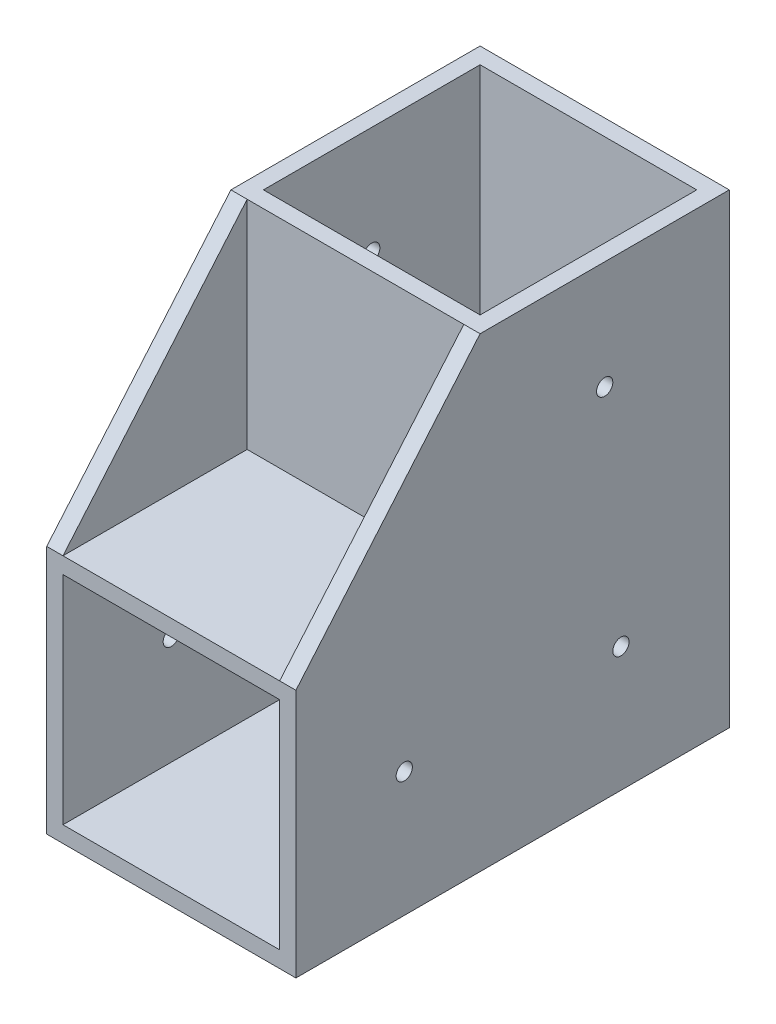
ISO-10303-21;
HEADER;
FILE_DESCRIPTION(('STEP AP214'),'2;1');
FILE_NAME('part.step','',(''),(''),'','','');
FILE_SCHEMA(('AUTOMOTIVE_DESIGN { 1 0 10303 214 1 1 1 1 }'));
ENDSEC;
DATA;
#1=APPLICATION_CONTEXT('core data for automotive mechanical design processes');
#2=APPLICATION_PROTOCOL_DEFINITION('international standard','automotive_design',2000,#1);
#3=PRODUCT_CONTEXT('',#1,'mechanical');
#4=PRODUCT('Part','Part','',(#3));
#5=PRODUCT_RELATED_PRODUCT_CATEGORY('part','',(#4));
#6=PRODUCT_DEFINITION_FORMATION('','',#4);
#7=PRODUCT_DEFINITION_CONTEXT('part definition',#1,'design');
#8=PRODUCT_DEFINITION('design','',#6,#7);
#9=PRODUCT_DEFINITION_SHAPE('','',#8);
#10=(LENGTH_UNIT() NAMED_UNIT(*) SI_UNIT(.MILLI.,.METRE.));
#11=(NAMED_UNIT(*) PLANE_ANGLE_UNIT() SI_UNIT($,.RADIAN.));
#12=(NAMED_UNIT(*) SI_UNIT($,.STERADIAN.) SOLID_ANGLE_UNIT());
#13=UNCERTAINTY_MEASURE_WITH_UNIT(LENGTH_MEASURE(1.E-05),#10,'distance_accuracy_value','');
#14=(GEOMETRIC_REPRESENTATION_CONTEXT(3) GLOBAL_UNCERTAINTY_ASSIGNED_CONTEXT((#13)) GLOBAL_UNIT_ASSIGNED_CONTEXT((#10,
#11,#12)) REPRESENTATION_CONTEXT('',''));
#15=CARTESIAN_POINT('',(0.,0.,0.));
#16=DIRECTION('',(0.,0.,1.));
#17=DIRECTION('',(1.,0.,0.));
#18=AXIS2_PLACEMENT_3D('',#15,#16,#17);
#19=CARTESIAN_POINT('',(0.,0.,80.));
#20=DIRECTION('',(0.,-1.,0.));
#21=DIRECTION('',(0.,0.,-1.));
#22=AXIS2_PLACEMENT_3D('',#19,#20,#21);
#23=PLANE('',#22);
#24=DIRECTION('',(0.,0.,1.));
#25=VECTOR('',#24,1.);
#26=CARTESIAN_POINT('',(3.,0.,80.));
#27=LINE('',#26,#25);
#28=CARTESIAN_POINT('',(3.,0.,46.));
#29=VERTEX_POINT('',#28);
#30=CARTESIAN_POINT('',(3.,0.,80.));
#31=VERTEX_POINT('',#30);
#32=EDGE_CURVE('E157',#29,#31,#27,.T.);
#33=ORIENTED_EDGE('',*,*,#32,.T.);
#34=DIRECTION('',(-1.,0.,0.));
#35=VECTOR('',#34,1.);
#36=CARTESIAN_POINT('',(0.,0.,80.));
#37=LINE('',#36,#35);
#38=CARTESIAN_POINT('',(43.,0.,80.));
#39=VERTEX_POINT('',#38);
#40=EDGE_CURVE('E231',#39,#31,#37,.T.);
#41=ORIENTED_EDGE('',*,*,#40,.F.);
#42=DIRECTION('',(0.,0.,-1.));
#43=VECTOR('',#42,1.);
#44=CARTESIAN_POINT('',(43.,0.,46.));
#45=LINE('',#44,#43);
#46=CARTESIAN_POINT('',(43.,0.,46.));
#47=VERTEX_POINT('',#46);
#48=EDGE_CURVE('E177',#39,#47,#45,.T.);
#49=ORIENTED_EDGE('',*,*,#48,.T.);
#50=DIRECTION('',(1.,0.,0.));
#51=VECTOR('',#50,1.);
#52=CARTESIAN_POINT('',(0.,0.,46.));
#53=LINE('',#52,#51);
#54=EDGE_CURVE('E170',#29,#47,#53,.T.);
#55=ORIENTED_EDGE('',*,*,#54,.F.);
#56=EDGE_LOOP('',(#33,#41,#49,#55));
#57=FACE_BOUND('',#56,.T.);
#58=ADVANCED_FACE('F42',(#57),#23,.F.);
#59=CARTESIAN_POINT('',(0.,40.,46.));
#60=DIRECTION('',(0.,0.,-1.));
#61=DIRECTION('',(-1.,0.,0.));
#62=AXIS2_PLACEMENT_3D('',#59,#60,#61);
#63=PLANE('',#62);
#64=DIRECTION('',(0.,-1.,0.));
#65=VECTOR('',#64,1.);
#66=CARTESIAN_POINT('',(3.,0.,46.));
#67=LINE('',#66,#65);
#68=CARTESIAN_POINT('',(3.,40.,46.));
#69=VERTEX_POINT('',#68);
#70=EDGE_CURVE('E160',#69,#29,#67,.T.);
#71=ORIENTED_EDGE('',*,*,#70,.T.);
#72=ORIENTED_EDGE('',*,*,#54,.T.);
#73=DIRECTION('',(0.,1.,0.));
#74=VECTOR('',#73,1.);
#75=CARTESIAN_POINT('',(43.,40.,46.));
#76=LINE('',#75,#74);
#77=CARTESIAN_POINT('',(43.,40.,46.));
#78=VERTEX_POINT('',#77);
#79=EDGE_CURVE('E272',#47,#78,#76,.T.);
#80=ORIENTED_EDGE('',*,*,#79,.T.);
#81=DIRECTION('',(1.,0.,0.));
#82=VECTOR('',#81,1.);
#83=CARTESIAN_POINT('',(0.,40.,46.));
#84=LINE('',#83,#82);
#85=EDGE_CURVE('E172',#69,#78,#84,.T.);
#86=ORIENTED_EDGE('',*,*,#85,.F.);
#87=EDGE_LOOP('',(#71,#72,#80,#86));
#88=FACE_BOUND('',#87,.T.);
#89=ADVANCED_FACE('F168',(#88),#63,.F.);
#90=CARTESIAN_POINT('',(0.,0.,80.));
#91=DIRECTION('',(0.,0.,1.));
#92=DIRECTION('',(1.,0.,0.));
#93=AXIS2_PLACEMENT_3D('',#90,#91,#92);
#94=PLANE('',#93);
#95=DIRECTION('',(0.,-1.,0.));
#96=VECTOR('',#95,1.);
#97=CARTESIAN_POINT('',(0.,0.,80.));
#98=LINE('',#97,#96);
#99=CARTESIAN_POINT('',(0.,0.,80.));
#100=VERTEX_POINT('',#99);
#101=CARTESIAN_POINT('',(0.,-46.,80.));
#102=VERTEX_POINT('',#101);
#103=EDGE_CURVE('E222',#100,#102,#98,.T.);
#104=ORIENTED_EDGE('',*,*,#103,.T.);
#105=DIRECTION('',(1.,0.,0.));
#106=VECTOR('',#105,1.);
#107=CARTESIAN_POINT('',(0.,-46.,80.));
#108=LINE('',#107,#106);
#109=CARTESIAN_POINT('',(46.,-46.,80.));
#110=VERTEX_POINT('',#109);
#111=EDGE_CURVE('E225',#102,#110,#108,.T.);
#112=ORIENTED_EDGE('',*,*,#111,.T.);
#113=DIRECTION('',(0.,1.,0.));
#114=VECTOR('',#113,1.);
#115=CARTESIAN_POINT('',(46.,0.,80.));
#116=LINE('',#115,#114);
#117=CARTESIAN_POINT('',(46.,0.,80.));
#118=VERTEX_POINT('',#117);
#119=EDGE_CURVE('E228',#110,#118,#116,.T.);
#120=ORIENTED_EDGE('',*,*,#119,.T.);
#121=EDGE_CURVE('E232',#118,#39,#37,.T.);
#122=ORIENTED_EDGE('',*,*,#121,.T.);
#123=ORIENTED_EDGE('',*,*,#40,.T.);
#124=DIRECTION('',(-1.,0.,0.));
#125=VECTOR('',#124,1.);
#126=CARTESIAN_POINT('',(3.,0.,80.));
#127=LINE('',#126,#125);
#128=EDGE_CURVE('E265',#31,#100,#127,.T.);
#129=ORIENTED_EDGE('',*,*,#128,.T.);
#130=EDGE_LOOP('',(#104,#112,#120,#122,#123,#129));
#131=FACE_BOUND('',#130,.T.);
#132=DIRECTION('',(1.,0.,0.));
#133=VECTOR('',#132,1.);
#134=CARTESIAN_POINT('',(3.00000000000001,-43.,80.));
#135=LINE('',#134,#133);
#136=CARTESIAN_POINT('',(3.00000000000001,-43.,80.));
#137=VERTEX_POINT('',#136);
#138=CARTESIAN_POINT('',(43.,-43.,80.));
#139=VERTEX_POINT('',#138);
#140=EDGE_CURVE('E192',#137,#139,#135,.T.);
#141=ORIENTED_EDGE('',*,*,#140,.F.);
#142=DIRECTION('',(0.,-1.,0.));
#143=VECTOR('',#142,1.);
#144=CARTESIAN_POINT('',(3.,-3.,80.));
#145=LINE('',#144,#143);
#146=CARTESIAN_POINT('',(3.,-3.,80.));
#147=VERTEX_POINT('',#146);
#148=EDGE_CURVE('E190',#147,#137,#145,.T.);
#149=ORIENTED_EDGE('',*,*,#148,.F.);
#150=DIRECTION('',(-1.,0.,0.));
#151=VECTOR('',#150,1.);
#152=CARTESIAN_POINT('',(3.,-3.,80.));
#153=LINE('',#152,#151);
#154=CARTESIAN_POINT('',(43.,-3.,80.));
#155=VERTEX_POINT('',#154);
#156=EDGE_CURVE('E198',#155,#147,#153,.T.);
#157=ORIENTED_EDGE('',*,*,#156,.F.);
#158=DIRECTION('',(0.,1.,0.));
#159=VECTOR('',#158,1.);
#160=CARTESIAN_POINT('',(43.,-3.,80.));
#161=LINE('',#160,#159);
#162=EDGE_CURVE('E195',#139,#155,#161,.T.);
#163=ORIENTED_EDGE('',*,*,#162,.F.);
#164=EDGE_LOOP('',(#141,#149,#157,#163));
#165=FACE_BOUND('',#164,.T.);
#166=ADVANCED_FACE('F324',(#131,#165),#94,.T.);
#167=CARTESIAN_POINT('',(0.,0.,0.));
#168=DIRECTION('',(0.,0.,1.));
#169=DIRECTION('',(1.,0.,0.));
#170=AXIS2_PLACEMENT_3D('',#167,#168,#169);
#171=PLANE('',#170);
#172=DIRECTION('',(0.,-1.,0.));
#173=VECTOR('',#172,1.);
#174=CARTESIAN_POINT('',(0.,0.,0.));
#175=LINE('',#174,#173);
#176=CARTESIAN_POINT('',(0.,40.,0.));
#177=VERTEX_POINT('',#176);
#178=CARTESIAN_POINT('',(0.,-46.,0.));
#179=VERTEX_POINT('',#178);
#180=EDGE_CURVE('E221',#177,#179,#175,.T.);
#181=ORIENTED_EDGE('',*,*,#180,.F.);
#182=DIRECTION('',(-1.,0.,0.));
#183=VECTOR('',#182,1.);
#184=CARTESIAN_POINT('',(0.,40.,0.));
#185=LINE('',#184,#183);
#186=CARTESIAN_POINT('',(46.,40.,0.));
#187=VERTEX_POINT('',#186);
#188=EDGE_CURVE('E188',#187,#177,#185,.T.);
#189=ORIENTED_EDGE('',*,*,#188,.F.);
#190=DIRECTION('',(0.,1.,0.));
#191=VECTOR('',#190,1.);
#192=CARTESIAN_POINT('',(46.,0.,0.));
#193=LINE('',#192,#191);
#194=CARTESIAN_POINT('',(46.,-46.,0.));
#195=VERTEX_POINT('',#194);
#196=EDGE_CURVE('E226',#195,#187,#193,.T.);
#197=ORIENTED_EDGE('',*,*,#196,.F.);
#198=DIRECTION('',(1.,0.,0.));
#199=VECTOR('',#198,1.);
#200=CARTESIAN_POINT('',(0.,-46.,0.));
#201=LINE('',#200,#199);
#202=EDGE_CURVE('E237',#179,#195,#201,.T.);
#203=ORIENTED_EDGE('',*,*,#202,.F.);
#204=EDGE_LOOP('',(#181,#189,#197,#203));
#205=FACE_BOUND('',#204,.T.);
#206=DIRECTION('',(0.,-1.,0.));
#207=VECTOR('',#206,1.);
#208=CARTESIAN_POINT('',(3.,-3.,0.));
#209=LINE('',#208,#207);
#210=CARTESIAN_POINT('',(3.,-3.,0.));
#211=VERTEX_POINT('',#210);
#212=CARTESIAN_POINT('',(3.00000000000001,-43.,0.));
#213=VERTEX_POINT('',#212);
#214=EDGE_CURVE('E201',#211,#213,#209,.T.);
#215=ORIENTED_EDGE('',*,*,#214,.T.);
#216=DIRECTION('',(1.,0.,0.));
#217=VECTOR('',#216,1.);
#218=CARTESIAN_POINT('',(3.00000000000001,-43.,0.));
#219=LINE('',#218,#217);
#220=CARTESIAN_POINT('',(43.,-43.,0.));
#221=VERTEX_POINT('',#220);
#222=EDGE_CURVE('E204',#213,#221,#219,.T.);
#223=ORIENTED_EDGE('',*,*,#222,.T.);
#224=DIRECTION('',(0.,1.,0.));
#225=VECTOR('',#224,1.);
#226=CARTESIAN_POINT('',(43.,-3.,0.));
#227=LINE('',#226,#225);
#228=CARTESIAN_POINT('',(43.,-3.,0.));
#229=VERTEX_POINT('',#228);
#230=EDGE_CURVE('E207',#221,#229,#227,.T.);
#231=ORIENTED_EDGE('',*,*,#230,.T.);
#232=DIRECTION('',(-1.,0.,0.));
#233=VECTOR('',#232,1.);
#234=CARTESIAN_POINT('',(3.,-3.,0.));
#235=LINE('',#234,#233);
#236=EDGE_CURVE('E193',#229,#211,#235,.T.);
#237=ORIENTED_EDGE('',*,*,#236,.T.);
#238=EDGE_LOOP('',(#215,#223,#231,#237));
#239=FACE_BOUND('',#238,.T.);
#240=ADVANCED_FACE('F334',(#205,#239),#171,.F.);
#241=CARTESIAN_POINT('',(0.,0.,80.));
#242=DIRECTION('',(1.,0.,0.));
#243=DIRECTION('',(0.,1.,0.));
#244=AXIS2_PLACEMENT_3D('',#241,#242,#243);
#245=PLANE('',#244);
#246=CARTESIAN_POINT('',(0.,20.,23.));
#247=DIRECTION('',(-1.,0.,0.));
#248=DIRECTION('',(0.,-1.,0.));
#249=AXIS2_PLACEMENT_3D('',#246,#247,#248);
#250=CIRCLE('',#249,1.5);
#251=CARTESIAN_POINT('',(0.,18.5,23.));
#252=VERTEX_POINT('',#251);
#253=EDGE_CURVE('E663',#252,#252,#250,.T.);
#254=ORIENTED_EDGE('',*,*,#253,.F.);
#255=EDGE_LOOP('',(#254));
#256=FACE_BOUND('',#255,.T.);
#257=CARTESIAN_POINT('',(0.,-23.,20.));
#258=DIRECTION('',(-1.,0.,0.));
#259=DIRECTION('',(0.,-1.,0.));
#260=AXIS2_PLACEMENT_3D('',#257,#258,#259);
#261=CIRCLE('',#260,1.5);
#262=CARTESIAN_POINT('',(0.,-24.5,20.));
#263=VERTEX_POINT('',#262);
#264=EDGE_CURVE('E661',#263,#263,#261,.T.);
#265=ORIENTED_EDGE('',*,*,#264,.F.);
#266=EDGE_LOOP('',(#265));
#267=FACE_BOUND('',#266,.T.);
#268=CARTESIAN_POINT('',(0.,-23.,60.));
#269=DIRECTION('',(-1.,0.,0.));
#270=DIRECTION('',(0.,-1.,0.));
#271=AXIS2_PLACEMENT_3D('',#268,#269,#270);
#272=CIRCLE('',#271,1.5);
#273=CARTESIAN_POINT('',(0.,-24.5,60.));
#274=VERTEX_POINT('',#273);
#275=EDGE_CURVE('E669',#274,#274,#272,.T.);
#276=ORIENTED_EDGE('',*,*,#275,.F.);
#277=EDGE_LOOP('',(#276));
#278=FACE_BOUND('',#277,.T.);
#279=ORIENTED_EDGE('',*,*,#180,.T.);
#280=DIRECTION('',(0.,0.,-1.));
#281=VECTOR('',#280,1.);
#282=CARTESIAN_POINT('',(0.,-46.,80.));
#283=LINE('',#282,#281);
#284=EDGE_CURVE('E11',#102,#179,#283,.T.);
#285=ORIENTED_EDGE('',*,*,#284,.F.);
#286=ORIENTED_EDGE('',*,*,#103,.F.);
#287=DIRECTION('',(0.,0.761939317759459,-0.64764842009554));
#288=VECTOR('',#287,1.);
#289=CARTESIAN_POINT('',(0.,40.,46.));
#290=LINE('',#289,#288);
#291=CARTESIAN_POINT('',(0.,40.,46.));
#292=VERTEX_POINT('',#291);
#293=EDGE_CURVE('E174',#100,#292,#290,.T.);
#294=ORIENTED_EDGE('',*,*,#293,.T.);
#295=DIRECTION('',(0.,0.,1.));
#296=VECTOR('',#295,1.);
#297=CARTESIAN_POINT('',(0.,40.,0.));
#298=LINE('',#297,#296);
#299=EDGE_CURVE('E178',#177,#292,#298,.T.);
#300=ORIENTED_EDGE('',*,*,#299,.F.);
#301=EDGE_LOOP('',(#279,#285,#286,#294,#300));
#302=FACE_BOUND('',#301,.T.);
#303=ADVANCED_FACE('F44',(#256,#267,#278,#302),#245,.F.);
#304=CARTESIAN_POINT('',(0.,-46.,80.));
#305=DIRECTION('',(0.,1.,0.));
#306=DIRECTION('',(0.,0.,1.));
#307=AXIS2_PLACEMENT_3D('',#304,#305,#306);
#308=PLANE('',#307);
#309=ORIENTED_EDGE('',*,*,#202,.T.);
#310=DIRECTION('',(0.,0.,-1.));
#311=VECTOR('',#310,1.);
#312=CARTESIAN_POINT('',(46.,-46.,80.));
#313=LINE('',#312,#311);
#314=EDGE_CURVE('E51',#110,#195,#313,.T.);
#315=ORIENTED_EDGE('',*,*,#314,.F.);
#316=ORIENTED_EDGE('',*,*,#111,.F.);
#317=ORIENTED_EDGE('',*,*,#284,.T.);
#318=EDGE_LOOP('',(#309,#315,#316,#317));
#319=FACE_BOUND('',#318,.T.);
#320=ADVANCED_FACE('F337',(#319),#308,.F.);
#321=CARTESIAN_POINT('',(46.,0.,80.));
#322=DIRECTION('',(-1.,0.,0.));
#323=DIRECTION('',(0.,-1.,0.));
#324=AXIS2_PLACEMENT_3D('',#321,#322,#323);
#325=PLANE('',#324);
#326=CARTESIAN_POINT('',(46.,20.,23.));
#327=DIRECTION('',(-1.,0.,0.));
#328=DIRECTION('',(0.,-1.,0.));
#329=AXIS2_PLACEMENT_3D('',#326,#327,#328);
#330=CIRCLE('',#329,1.5);
#331=CARTESIAN_POINT('',(46.,18.5,23.));
#332=VERTEX_POINT('',#331);
#333=EDGE_CURVE('E245',#332,#332,#330,.T.);
#334=ORIENTED_EDGE('',*,*,#333,.T.);
#335=EDGE_LOOP('',(#334));
#336=FACE_BOUND('',#335,.T.);
#337=CARTESIAN_POINT('',(46.,-23.,20.));
#338=DIRECTION('',(-1.,0.,0.));
#339=DIRECTION('',(0.,-1.,0.));
#340=AXIS2_PLACEMENT_3D('',#337,#338,#339);
#341=CIRCLE('',#340,1.5);
#342=CARTESIAN_POINT('',(46.,-24.5,20.));
#343=VERTEX_POINT('',#342);
#344=EDGE_CURVE('E664',#343,#343,#341,.T.);
#345=ORIENTED_EDGE('',*,*,#344,.T.);
#346=EDGE_LOOP('',(#345));
#347=FACE_BOUND('',#346,.T.);
#348=CARTESIAN_POINT('',(46.,-23.,60.));
#349=DIRECTION('',(-1.,0.,0.));
#350=DIRECTION('',(0.,-1.,0.));
#351=AXIS2_PLACEMENT_3D('',#348,#349,#350);
#352=CIRCLE('',#351,1.5);
#353=CARTESIAN_POINT('',(46.,-24.5,60.));
#354=VERTEX_POINT('',#353);
#355=EDGE_CURVE('E258',#354,#354,#352,.T.);
#356=ORIENTED_EDGE('',*,*,#355,.T.);
#357=EDGE_LOOP('',(#356));
#358=FACE_BOUND('',#357,.T.);
#359=ORIENTED_EDGE('',*,*,#196,.T.);
#360=DIRECTION('',(0.,0.,-1.));
#361=VECTOR('',#360,1.);
#362=CARTESIAN_POINT('',(46.,40.,0.));
#363=LINE('',#362,#361);
#364=CARTESIAN_POINT('',(46.,40.,46.));
#365=VERTEX_POINT('',#364);
#366=EDGE_CURVE('E308',#365,#187,#363,.T.);
#367=ORIENTED_EDGE('',*,*,#366,.F.);
#368=DIRECTION('',(0.,-0.761939317759459,0.64764842009554));
#369=VECTOR('',#368,1.);
#370=CARTESIAN_POINT('',(46.,0.,80.));
#371=LINE('',#370,#369);
#372=EDGE_CURVE('E270',#365,#118,#371,.T.);
#373=ORIENTED_EDGE('',*,*,#372,.T.);
#374=ORIENTED_EDGE('',*,*,#119,.F.);
#375=ORIENTED_EDGE('',*,*,#314,.T.);
#376=EDGE_LOOP('',(#359,#367,#373,#374,#375));
#377=FACE_BOUND('',#376,.T.);
#378=ADVANCED_FACE('F332',(#336,#347,#358,#377),#325,.F.);
#379=CARTESIAN_POINT('',(3.,-3.,80.));
#380=DIRECTION('',(1.,0.,0.));
#381=DIRECTION('',(0.,1.,0.));
#382=AXIS2_PLACEMENT_3D('',#379,#380,#381);
#383=PLANE('',#382);
#384=CARTESIAN_POINT('',(3.,-23.,20.));
#385=DIRECTION('',(1.,0.,0.));
#386=DIRECTION('',(0.,1.,0.));
#387=AXIS2_PLACEMENT_3D('',#384,#385,#386);
#388=CIRCLE('',#387,1.5);
#389=CARTESIAN_POINT('',(3.,-21.5,20.));
#390=VERTEX_POINT('',#389);
#391=EDGE_CURVE('E261',#390,#390,#388,.T.);
#392=ORIENTED_EDGE('',*,*,#391,.F.);
#393=EDGE_LOOP('',(#392));
#394=FACE_BOUND('',#393,.T.);
#395=CARTESIAN_POINT('',(3.,-23.,60.));
#396=DIRECTION('',(1.,0.,0.));
#397=DIRECTION('',(0.,1.,0.));
#398=AXIS2_PLACEMENT_3D('',#395,#396,#397);
#399=CIRCLE('',#398,1.5);
#400=CARTESIAN_POINT('',(3.,-21.5,60.));
#401=VERTEX_POINT('',#400);
#402=EDGE_CURVE('E248',#401,#401,#399,.T.);
#403=ORIENTED_EDGE('',*,*,#402,.F.);
#404=EDGE_LOOP('',(#403));
#405=FACE_BOUND('',#404,.T.);
#406=ORIENTED_EDGE('',*,*,#214,.F.);
#407=DIRECTION('',(0.,0.,-1.));
#408=VECTOR('',#407,1.);
#409=CARTESIAN_POINT('',(3.,-3.,80.));
#410=LINE('',#409,#408);
#411=EDGE_CURVE('E200',#147,#211,#410,.T.);
#412=ORIENTED_EDGE('',*,*,#411,.F.);
#413=ORIENTED_EDGE('',*,*,#148,.T.);
#414=DIRECTION('',(0.,0.,-1.));
#415=VECTOR('',#414,1.);
#416=CARTESIAN_POINT('',(3.00000000000001,-43.,80.));
#417=LINE('',#416,#415);
#418=EDGE_CURVE('E218',#137,#213,#417,.T.);
#419=ORIENTED_EDGE('',*,*,#418,.T.);
#420=EDGE_LOOP('',(#406,#412,#413,#419));
#421=FACE_BOUND('',#420,.T.);
#422=ADVANCED_FACE('F343',(#394,#405,#421),#383,.T.);
#423=CARTESIAN_POINT('',(3.00000000000001,-43.,80.));
#424=DIRECTION('',(0.,1.,0.));
#425=DIRECTION('',(0.,0.,1.));
#426=AXIS2_PLACEMENT_3D('',#423,#424,#425);
#427=PLANE('',#426);
#428=ORIENTED_EDGE('',*,*,#222,.F.);
#429=ORIENTED_EDGE('',*,*,#418,.F.);
#430=ORIENTED_EDGE('',*,*,#140,.T.);
#431=DIRECTION('',(0.,0.,-1.));
#432=VECTOR('',#431,1.);
#433=CARTESIAN_POINT('',(43.,-43.,80.));
#434=LINE('',#433,#432);
#435=EDGE_CURVE('E216',#139,#221,#434,.T.);
#436=ORIENTED_EDGE('',*,*,#435,.T.);
#437=EDGE_LOOP('',(#428,#429,#430,#436));
#438=FACE_BOUND('',#437,.T.);
#439=ADVANCED_FACE('F398',(#438),#427,.T.);
#440=CARTESIAN_POINT('',(43.,-3.,80.));
#441=DIRECTION('',(-1.,0.,0.));
#442=DIRECTION('',(0.,-1.,0.));
#443=AXIS2_PLACEMENT_3D('',#440,#441,#442);
#444=PLANE('',#443);
#445=CARTESIAN_POINT('',(43.,-23.,20.));
#446=DIRECTION('',(-1.,0.,0.));
#447=DIRECTION('',(0.,-1.,0.));
#448=AXIS2_PLACEMENT_3D('',#445,#446,#447);
#449=CIRCLE('',#448,1.5);
#450=CARTESIAN_POINT('',(43.,-24.5,20.));
#451=VERTEX_POINT('',#450);
#452=EDGE_CURVE('E46',#451,#451,#449,.T.);
#453=ORIENTED_EDGE('',*,*,#452,.F.);
#454=EDGE_LOOP('',(#453));
#455=FACE_BOUND('',#454,.T.);
#456=CARTESIAN_POINT('',(43.,-23.,60.));
#457=DIRECTION('',(-1.,0.,0.));
#458=DIRECTION('',(0.,-1.,0.));
#459=AXIS2_PLACEMENT_3D('',#456,#457,#458);
#460=CIRCLE('',#459,1.5);
#461=CARTESIAN_POINT('',(43.,-24.5,60.));
#462=VERTEX_POINT('',#461);
#463=EDGE_CURVE('E246',#462,#462,#460,.T.);
#464=ORIENTED_EDGE('',*,*,#463,.F.);
#465=EDGE_LOOP('',(#464));
#466=FACE_BOUND('',#465,.T.);
#467=ORIENTED_EDGE('',*,*,#230,.F.);
#468=ORIENTED_EDGE('',*,*,#435,.F.);
#469=ORIENTED_EDGE('',*,*,#162,.T.);
#470=DIRECTION('',(0.,0.,-1.));
#471=VECTOR('',#470,1.);
#472=CARTESIAN_POINT('',(43.,-3.,80.));
#473=LINE('',#472,#471);
#474=EDGE_CURVE('E214',#155,#229,#473,.T.);
#475=ORIENTED_EDGE('',*,*,#474,.T.);
#476=EDGE_LOOP('',(#467,#468,#469,#475));
#477=FACE_BOUND('',#476,.T.);
#478=ADVANCED_FACE('F394',(#455,#466,#477),#444,.T.);
#479=CARTESIAN_POINT('',(3.,-3.,80.));
#480=DIRECTION('',(0.,-1.,0.));
#481=DIRECTION('',(0.,0.,-1.));
#482=AXIS2_PLACEMENT_3D('',#479,#480,#481);
#483=PLANE('',#482);
#484=ORIENTED_EDGE('',*,*,#236,.F.);
#485=ORIENTED_EDGE('',*,*,#474,.F.);
#486=ORIENTED_EDGE('',*,*,#156,.T.);
#487=ORIENTED_EDGE('',*,*,#411,.T.);
#488=EDGE_LOOP('',(#484,#485,#486,#487));
#489=FACE_BOUND('',#488,.T.);
#490=ADVANCED_FACE('F390',(#489),#483,.T.);
#491=CARTESIAN_POINT('',(0.,40.,0.));
#492=DIRECTION('',(0.,1.,0.));
#493=DIRECTION('',(0.,0.,1.));
#494=AXIS2_PLACEMENT_3D('',#491,#492,#493);
#495=PLANE('',#494);
#496=ORIENTED_EDGE('',*,*,#299,.T.);
#497=EDGE_CURVE('E307',#292,#69,#84,.T.);
#498=ORIENTED_EDGE('',*,*,#497,.T.);
#499=ORIENTED_EDGE('',*,*,#85,.T.);
#500=DIRECTION('',(1.,0.,0.));
#501=VECTOR('',#500,1.);
#502=CARTESIAN_POINT('',(43.,40.,46.));
#503=LINE('',#502,#501);
#504=EDGE_CURVE('E277',#78,#365,#503,.T.);
#505=ORIENTED_EDGE('',*,*,#504,.T.);
#506=ORIENTED_EDGE('',*,*,#366,.T.);
#507=ORIENTED_EDGE('',*,*,#188,.T.);
#508=EDGE_LOOP('',(#496,#498,#499,#505,#506,#507));
#509=FACE_BOUND('',#508,.T.);
#510=DIRECTION('',(1.,0.,0.));
#511=VECTOR('',#510,1.);
#512=CARTESIAN_POINT('',(3.,40.,43.));
#513=LINE('',#512,#511);
#514=CARTESIAN_POINT('',(3.,40.,43.));
#515=VERTEX_POINT('',#514);
#516=CARTESIAN_POINT('',(43.,40.,43.));
#517=VERTEX_POINT('',#516);
#518=EDGE_CURVE('E285',#515,#517,#513,.T.);
#519=ORIENTED_EDGE('',*,*,#518,.F.);
#520=DIRECTION('',(0.,0.,1.));
#521=VECTOR('',#520,1.);
#522=CARTESIAN_POINT('',(3.,40.,3.));
#523=LINE('',#522,#521);
#524=CARTESIAN_POINT('',(3.,40.,3.));
#525=VERTEX_POINT('',#524);
#526=EDGE_CURVE('E283',#525,#515,#523,.T.);
#527=ORIENTED_EDGE('',*,*,#526,.F.);
#528=DIRECTION('',(-1.,0.,0.));
#529=VECTOR('',#528,1.);
#530=CARTESIAN_POINT('',(3.,40.,3.));
#531=LINE('',#530,#529);
#532=CARTESIAN_POINT('',(43.,40.,3.));
#533=VERTEX_POINT('',#532);
#534=EDGE_CURVE('E291',#533,#525,#531,.T.);
#535=ORIENTED_EDGE('',*,*,#534,.F.);
#536=DIRECTION('',(0.,0.,-1.));
#537=VECTOR('',#536,1.);
#538=CARTESIAN_POINT('',(43.,40.,3.));
#539=LINE('',#538,#537);
#540=EDGE_CURVE('E288',#517,#533,#539,.T.);
#541=ORIENTED_EDGE('',*,*,#540,.F.);
#542=EDGE_LOOP('',(#519,#527,#535,#541));
#543=FACE_BOUND('',#542,.T.);
#544=ADVANCED_FACE('F315',(#509,#543),#495,.T.);
#545=CARTESIAN_POINT('',(3.,40.,3.));
#546=DIRECTION('',(1.,0.,0.));
#547=DIRECTION('',(0.,0.,-1.));
#548=AXIS2_PLACEMENT_3D('',#545,#546,#547);
#549=PLANE('',#548);
#550=CARTESIAN_POINT('',(3.,20.,23.));
#551=DIRECTION('',(1.,0.,0.));
#552=DIRECTION('',(0.,0.,-1.));
#553=AXIS2_PLACEMENT_3D('',#550,#551,#552);
#554=CIRCLE('',#553,1.5);
#555=CARTESIAN_POINT('',(3.,20.,21.5));
#556=VERTEX_POINT('',#555);
#557=EDGE_CURVE('E244',#556,#556,#554,.T.);
#558=ORIENTED_EDGE('',*,*,#557,.F.);
#559=EDGE_LOOP('',(#558));
#560=FACE_BOUND('',#559,.T.);
#561=DIRECTION('',(0.,0.,1.));
#562=VECTOR('',#561,1.);
#563=CARTESIAN_POINT('',(3.,0.,3.));
#564=LINE('',#563,#562);
#565=CARTESIAN_POINT('',(3.,0.,3.));
#566=VERTEX_POINT('',#565);
#567=CARTESIAN_POINT('',(3.,0.,43.));
#568=VERTEX_POINT('',#567);
#569=EDGE_CURVE('E282',#566,#568,#564,.T.);
#570=ORIENTED_EDGE('',*,*,#569,.F.);
#571=DIRECTION('',(0.,-1.,0.));
#572=VECTOR('',#571,1.);
#573=CARTESIAN_POINT('',(3.,40.,3.));
#574=LINE('',#573,#572);
#575=EDGE_CURVE('E67',#525,#566,#574,.T.);
#576=ORIENTED_EDGE('',*,*,#575,.F.);
#577=ORIENTED_EDGE('',*,*,#526,.T.);
#578=DIRECTION('',(0.,-1.,0.));
#579=VECTOR('',#578,1.);
#580=CARTESIAN_POINT('',(3.,40.,43.));
#581=LINE('',#580,#579);
#582=EDGE_CURVE('E179',#515,#568,#581,.T.);
#583=ORIENTED_EDGE('',*,*,#582,.T.);
#584=EDGE_LOOP('',(#570,#576,#577,#583));
#585=FACE_BOUND('',#584,.T.);
#586=ADVANCED_FACE('F375',(#560,#585),#549,.T.);
#587=CARTESIAN_POINT('',(3.,40.,43.));
#588=DIRECTION('',(0.,0.,-1.));
#589=DIRECTION('',(-1.,0.,0.));
#590=AXIS2_PLACEMENT_3D('',#587,#588,#589);
#591=PLANE('',#590);
#592=DIRECTION('',(1.,0.,0.));
#593=VECTOR('',#592,1.);
#594=CARTESIAN_POINT('',(3.,0.,43.));
#595=LINE('',#594,#593);
#596=CARTESIAN_POINT('',(43.,0.,43.));
#597=VERTEX_POINT('',#596);
#598=EDGE_CURVE('E295',#568,#597,#595,.T.);
#599=ORIENTED_EDGE('',*,*,#598,.F.);
#600=ORIENTED_EDGE('',*,*,#582,.F.);
#601=ORIENTED_EDGE('',*,*,#518,.T.);
#602=DIRECTION('',(0.,-1.,0.));
#603=VECTOR('',#602,1.);
#604=CARTESIAN_POINT('',(43.,40.,43.));
#605=LINE('',#604,#603);
#606=EDGE_CURVE('E184',#517,#597,#605,.T.);
#607=ORIENTED_EDGE('',*,*,#606,.T.);
#608=EDGE_LOOP('',(#599,#600,#601,#607));
#609=FACE_BOUND('',#608,.T.);
#610=ADVANCED_FACE('F377',(#609),#591,.T.);
#611=CARTESIAN_POINT('',(43.,40.,3.));
#612=DIRECTION('',(-1.,0.,0.));
#613=DIRECTION('',(0.,0.,1.));
#614=AXIS2_PLACEMENT_3D('',#611,#612,#613);
#615=PLANE('',#614);
#616=CARTESIAN_POINT('',(43.,20.,23.));
#617=DIRECTION('',(-1.,0.,0.));
#618=DIRECTION('',(0.,0.,1.));
#619=AXIS2_PLACEMENT_3D('',#616,#617,#618);
#620=CIRCLE('',#619,1.5);
#621=CARTESIAN_POINT('',(43.,20.,24.5));
#622=VERTEX_POINT('',#621);
#623=EDGE_CURVE('E242',#622,#622,#620,.T.);
#624=ORIENTED_EDGE('',*,*,#623,.F.);
#625=EDGE_LOOP('',(#624));
#626=FACE_BOUND('',#625,.T.);
#627=DIRECTION('',(0.,0.,-1.));
#628=VECTOR('',#627,1.);
#629=CARTESIAN_POINT('',(43.,0.,3.));
#630=LINE('',#629,#628);
#631=CARTESIAN_POINT('',(43.,0.,3.));
#632=VERTEX_POINT('',#631);
#633=EDGE_CURVE('E298',#597,#632,#630,.T.);
#634=ORIENTED_EDGE('',*,*,#633,.F.);
#635=ORIENTED_EDGE('',*,*,#606,.F.);
#636=ORIENTED_EDGE('',*,*,#540,.T.);
#637=DIRECTION('',(0.,-1.,0.));
#638=VECTOR('',#637,1.);
#639=CARTESIAN_POINT('',(43.,40.,3.));
#640=LINE('',#639,#638);
#641=EDGE_CURVE('E304',#533,#632,#640,.T.);
#642=ORIENTED_EDGE('',*,*,#641,.T.);
#643=EDGE_LOOP('',(#634,#635,#636,#642));
#644=FACE_BOUND('',#643,.T.);
#645=ADVANCED_FACE('F364',(#626,#644),#615,.T.);
#646=CARTESIAN_POINT('',(3.,40.,3.));
#647=DIRECTION('',(0.,0.,1.));
#648=DIRECTION('',(1.,0.,0.));
#649=AXIS2_PLACEMENT_3D('',#646,#647,#648);
#650=PLANE('',#649);
#651=DIRECTION('',(-1.,0.,0.));
#652=VECTOR('',#651,1.);
#653=CARTESIAN_POINT('',(3.,0.,3.));
#654=LINE('',#653,#652);
#655=EDGE_CURVE('E286',#632,#566,#654,.T.);
#656=ORIENTED_EDGE('',*,*,#655,.F.);
#657=ORIENTED_EDGE('',*,*,#641,.F.);
#658=ORIENTED_EDGE('',*,*,#534,.T.);
#659=ORIENTED_EDGE('',*,*,#575,.T.);
#660=EDGE_LOOP('',(#656,#657,#658,#659));
#661=FACE_BOUND('',#660,.T.);
#662=ADVANCED_FACE('F356',(#661),#650,.T.);
#663=ORIENTED_EDGE('',*,*,#655,.T.);
#664=ORIENTED_EDGE('',*,*,#569,.T.);
#665=ORIENTED_EDGE('',*,*,#598,.T.);
#666=ORIENTED_EDGE('',*,*,#633,.T.);
#667=EDGE_LOOP('',(#663,#664,#665,#666));
#668=FACE_BOUND('',#667,.T.);
#669=ADVANCED_FACE('F349',(#668),#23,.F.);
#670=CARTESIAN_POINT('',(43.,0.,80.));
#671=DIRECTION('',(0.,0.64764842009554,0.761939317759459));
#672=DIRECTION('',(0.,-0.761939317759459,0.64764842009554));
#673=AXIS2_PLACEMENT_3D('',#670,#671,#672);
#674=PLANE('',#673);
#675=ORIENTED_EDGE('',*,*,#372,.F.);
#676=ORIENTED_EDGE('',*,*,#504,.F.);
#677=DIRECTION('',(0.,-0.761939317759459,0.64764842009554));
#678=VECTOR('',#677,1.);
#679=CARTESIAN_POINT('',(43.,0.,80.));
#680=LINE('',#679,#678);
#681=EDGE_CURVE('E274',#78,#39,#680,.T.);
#682=ORIENTED_EDGE('',*,*,#681,.T.);
#683=ORIENTED_EDGE('',*,*,#121,.F.);
#684=EDGE_LOOP('',(#675,#676,#682,#683));
#685=FACE_BOUND('',#684,.T.);
#686=ADVANCED_FACE('F328',(#685),#674,.T.);
#687=CARTESIAN_POINT('',(43.,0.,0.));
#688=DIRECTION('',(1.,0.,0.));
#689=DIRECTION('',(0.,1.,0.));
#690=AXIS2_PLACEMENT_3D('',#687,#688,#689);
#691=PLANE('',#690);
#692=ORIENTED_EDGE('',*,*,#48,.F.);
#693=ORIENTED_EDGE('',*,*,#681,.F.);
#694=ORIENTED_EDGE('',*,*,#79,.F.);
#695=EDGE_LOOP('',(#692,#693,#694));
#696=FACE_BOUND('',#695,.T.);
#697=ADVANCED_FACE('F362',(#696),#691,.F.);
#698=CARTESIAN_POINT('',(2.99999999999999,40.,46.));
#699=DIRECTION('',(0.,0.64764842009554,0.761939317759459));
#700=DIRECTION('',(0.,-0.761939317759459,0.64764842009554));
#701=AXIS2_PLACEMENT_3D('',#698,#699,#700);
#702=PLANE('',#701);
#703=ORIENTED_EDGE('',*,*,#293,.F.);
#704=ORIENTED_EDGE('',*,*,#128,.F.);
#705=DIRECTION('',(0.,0.761939317759459,-0.64764842009554));
#706=VECTOR('',#705,1.);
#707=CARTESIAN_POINT('',(2.99999999999999,40.,46.));
#708=LINE('',#707,#706);
#709=EDGE_CURVE('E59',#31,#69,#708,.T.);
#710=ORIENTED_EDGE('',*,*,#709,.T.);
#711=ORIENTED_EDGE('',*,*,#497,.F.);
#712=EDGE_LOOP('',(#703,#704,#710,#711));
#713=FACE_BOUND('',#712,.T.);
#714=ADVANCED_FACE('F322',(#713),#702,.T.);
#715=CARTESIAN_POINT('',(3.,0.,0.));
#716=DIRECTION('',(-1.,0.,0.));
#717=DIRECTION('',(0.,-1.,0.));
#718=AXIS2_PLACEMENT_3D('',#715,#716,#717);
#719=PLANE('',#718);
#720=ORIENTED_EDGE('',*,*,#70,.F.);
#721=ORIENTED_EDGE('',*,*,#709,.F.);
#722=ORIENTED_EDGE('',*,*,#32,.F.);
#723=EDGE_LOOP('',(#720,#721,#722));
#724=FACE_BOUND('',#723,.T.);
#725=ADVANCED_FACE('F159',(#724),#719,.F.);
#726=CARTESIAN_POINT('',(46.,20.,23.));
#727=DIRECTION('',(-1.,0.,0.));
#728=DIRECTION('',(0.,-1.,0.));
#729=AXIS2_PLACEMENT_3D('',#726,#727,#728);
#730=CYLINDRICAL_SURFACE('',#729,1.5);
#731=ORIENTED_EDGE('',*,*,#623,.T.);
#732=EDGE_LOOP('',(#731));
#733=FACE_BOUND('',#732,.T.);
#734=ORIENTED_EDGE('',*,*,#333,.F.);
#735=EDGE_LOOP('',(#734));
#736=FACE_BOUND('',#735,.T.);
#737=ADVANCED_FACE('F472',(#733,#736),#730,.F.);
#738=ORIENTED_EDGE('',*,*,#557,.T.);
#739=EDGE_LOOP('',(#738));
#740=FACE_BOUND('',#739,.T.);
#741=ORIENTED_EDGE('',*,*,#253,.T.);
#742=EDGE_LOOP('',(#741));
#743=FACE_BOUND('',#742,.T.);
#744=ADVANCED_FACE('F477',(#740,#743),#730,.F.);
#745=CARTESIAN_POINT('',(46.,-23.,60.));
#746=DIRECTION('',(-1.,0.,0.));
#747=DIRECTION('',(0.,-1.,0.));
#748=AXIS2_PLACEMENT_3D('',#745,#746,#747);
#749=CYLINDRICAL_SURFACE('',#748,1.5);
#750=ORIENTED_EDGE('',*,*,#463,.T.);
#751=EDGE_LOOP('',(#750));
#752=FACE_BOUND('',#751,.T.);
#753=ORIENTED_EDGE('',*,*,#355,.F.);
#754=EDGE_LOOP('',(#753));
#755=FACE_BOUND('',#754,.T.);
#756=ADVANCED_FACE('F488',(#752,#755),#749,.F.);
#757=CARTESIAN_POINT('',(46.,-23.,20.));
#758=DIRECTION('',(-1.,0.,0.));
#759=DIRECTION('',(0.,-1.,0.));
#760=AXIS2_PLACEMENT_3D('',#757,#758,#759);
#761=CYLINDRICAL_SURFACE('',#760,1.5);
#762=ORIENTED_EDGE('',*,*,#452,.T.);
#763=EDGE_LOOP('',(#762));
#764=FACE_BOUND('',#763,.T.);
#765=ORIENTED_EDGE('',*,*,#344,.F.);
#766=EDGE_LOOP('',(#765));
#767=FACE_BOUND('',#766,.T.);
#768=ADVANCED_FACE('F497',(#764,#767),#761,.F.);
#769=ORIENTED_EDGE('',*,*,#402,.T.);
#770=EDGE_LOOP('',(#769));
#771=FACE_BOUND('',#770,.T.);
#772=ORIENTED_EDGE('',*,*,#275,.T.);
#773=EDGE_LOOP('',(#772));
#774=FACE_BOUND('',#773,.T.);
#775=ADVANCED_FACE('F499',(#771,#774),#749,.F.);
#776=ORIENTED_EDGE('',*,*,#391,.T.);
#777=EDGE_LOOP('',(#776));
#778=FACE_BOUND('',#777,.T.);
#779=ORIENTED_EDGE('',*,*,#264,.T.);
#780=EDGE_LOOP('',(#779));
#781=FACE_BOUND('',#780,.T.);
#782=ADVANCED_FACE('F510',(#778,#781),#761,.F.);
#783=CLOSED_SHELL('',(#58,#89,#166,#240,#303,#320,#378,#422,#439,#478,#490,#544,#586,#610,#645,
#662,#669,#686,#697,#714,#725,#737,#744,#756,#768,#775,#782));
#784=MANIFOLD_SOLID_BREP('B2',#783);
#785=ADVANCED_BREP_SHAPE_REPRESENTATION('',(#18,#784),#14);
#786=SHAPE_DEFINITION_REPRESENTATION(#9,#785);
ENDSEC;
END-ISO-10303-21;
